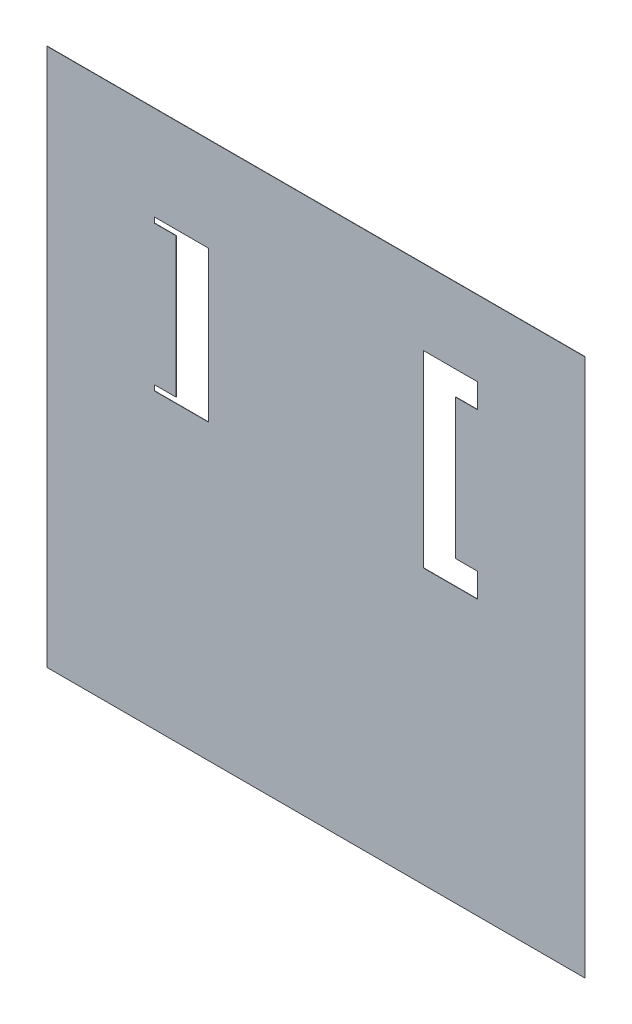
ISO-10303-21;
HEADER;
FILE_DESCRIPTION(('STEP AP214'),'2;1');
FILE_NAME('part.step','',(''),(''),'','','');
FILE_SCHEMA(('AUTOMOTIVE_DESIGN { 1 0 10303 214 1 1 1 1 }'));
ENDSEC;
DATA;
#1=APPLICATION_CONTEXT('core data for automotive mechanical design processes');
#2=APPLICATION_PROTOCOL_DEFINITION('international standard','automotive_design',2000,#1);
#3=PRODUCT_CONTEXT('',#1,'mechanical');
#4=PRODUCT('Part','Part','',(#3));
#5=PRODUCT_RELATED_PRODUCT_CATEGORY('part','',(#4));
#6=PRODUCT_DEFINITION_FORMATION('','',#4);
#7=PRODUCT_DEFINITION_CONTEXT('part definition',#1,'design');
#8=PRODUCT_DEFINITION('design','',#6,#7);
#9=PRODUCT_DEFINITION_SHAPE('','',#8);
#10=(LENGTH_UNIT() NAMED_UNIT(*) SI_UNIT(.MILLI.,.METRE.));
#11=(NAMED_UNIT(*) PLANE_ANGLE_UNIT() SI_UNIT($,.RADIAN.));
#12=(NAMED_UNIT(*) SI_UNIT($,.STERADIAN.) SOLID_ANGLE_UNIT());
#13=UNCERTAINTY_MEASURE_WITH_UNIT(LENGTH_MEASURE(1.E-05),#10,'distance_accuracy_value','');
#14=(GEOMETRIC_REPRESENTATION_CONTEXT(3) GLOBAL_UNCERTAINTY_ASSIGNED_CONTEXT((#13)) GLOBAL_UNIT_ASSIGNED_CONTEXT((#10,
#11,#12)) REPRESENTATION_CONTEXT('',''));
#15=CARTESIAN_POINT('',(0.,0.,0.));
#16=DIRECTION('',(0.,0.,1.));
#17=DIRECTION('',(1.,0.,0.));
#18=AXIS2_PLACEMENT_3D('',#15,#16,#17);
#19=CARTESIAN_POINT('',(0.,0.,0.0127));
#20=DIRECTION('',(1.,0.,0.));
#21=DIRECTION('',(0.,0.,-1.));
#22=AXIS2_PLACEMENT_3D('',#19,#20,#21);
#23=PLANE('',#22);
#24=DIRECTION('',(0.,-1.,0.));
#25=VECTOR('',#24,1.);
#26=CARTESIAN_POINT('',(0.,0.,0.));
#27=LINE('',#26,#25);
#28=CARTESIAN_POINT('',(0.,25.4,0.));
#29=VERTEX_POINT('',#28);
#30=CARTESIAN_POINT('',(0.,0.,0.));
#31=VERTEX_POINT('',#30);
#32=EDGE_CURVE('E315',#29,#31,#27,.T.);
#33=ORIENTED_EDGE('',*,*,#32,.T.);
#34=DIRECTION('',(0.,0.,-1.));
#35=VECTOR('',#34,1.);
#36=CARTESIAN_POINT('',(0.,0.,0.0127));
#37=LINE('',#36,#35);
#38=CARTESIAN_POINT('',(0.,0.,0.0127));
#39=VERTEX_POINT('',#38);
#40=EDGE_CURVE('E11',#39,#31,#37,.T.);
#41=ORIENTED_EDGE('',*,*,#40,.F.);
#42=DIRECTION('',(0.,-1.,0.));
#43=VECTOR('',#42,1.);
#44=CARTESIAN_POINT('',(0.,0.,0.0127));
#45=LINE('',#44,#43);
#46=CARTESIAN_POINT('',(0.,25.4,0.0127));
#47=VERTEX_POINT('',#46);
#48=EDGE_CURVE('E316',#47,#39,#45,.T.);
#49=ORIENTED_EDGE('',*,*,#48,.F.);
#50=DIRECTION('',(0.,0.,-1.));
#51=VECTOR('',#50,1.);
#52=CARTESIAN_POINT('',(0.,25.4,0.0127));
#53=LINE('',#52,#51);
#54=EDGE_CURVE('E326',#47,#29,#53,.T.);
#55=ORIENTED_EDGE('',*,*,#54,.T.);
#56=EDGE_LOOP('',(#33,#41,#49,#55));
#57=FACE_BOUND('',#56,.T.);
#58=ADVANCED_FACE('F34',(#57),#23,.F.);
#59=CARTESIAN_POINT('',(0.,0.,0.0127));
#60=DIRECTION('',(0.,1.,0.));
#61=DIRECTION('',(0.,0.,1.));
#62=AXIS2_PLACEMENT_3D('',#59,#60,#61);
#63=PLANE('',#62);
#64=DIRECTION('',(1.,0.,0.));
#65=VECTOR('',#64,1.);
#66=CARTESIAN_POINT('',(0.,0.,0.));
#67=LINE('',#66,#65);
#68=CARTESIAN_POINT('',(25.4,0.,0.));
#69=VERTEX_POINT('',#68);
#70=EDGE_CURVE('E329',#31,#69,#67,.T.);
#71=ORIENTED_EDGE('',*,*,#70,.T.);
#72=DIRECTION('',(0.,0.,-1.));
#73=VECTOR('',#72,1.);
#74=CARTESIAN_POINT('',(25.4,0.,0.0127));
#75=LINE('',#74,#73);
#76=CARTESIAN_POINT('',(25.4,0.,0.0127));
#77=VERTEX_POINT('',#76);
#78=EDGE_CURVE('E41',#77,#69,#75,.T.);
#79=ORIENTED_EDGE('',*,*,#78,.F.);
#80=DIRECTION('',(1.,0.,0.));
#81=VECTOR('',#80,1.);
#82=CARTESIAN_POINT('',(0.,0.,0.0127));
#83=LINE('',#82,#81);
#84=EDGE_CURVE('E319',#39,#77,#83,.T.);
#85=ORIENTED_EDGE('',*,*,#84,.F.);
#86=ORIENTED_EDGE('',*,*,#40,.T.);
#87=EDGE_LOOP('',(#71,#79,#85,#86));
#88=FACE_BOUND('',#87,.T.);
#89=ADVANCED_FACE('F358',(#88),#63,.F.);
#90=CARTESIAN_POINT('',(25.4,0.,0.0127));
#91=DIRECTION('',(-1.,0.,0.));
#92=DIRECTION('',(0.,0.,1.));
#93=AXIS2_PLACEMENT_3D('',#90,#91,#92);
#94=PLANE('',#93);
#95=DIRECTION('',(0.,1.,0.));
#96=VECTOR('',#95,1.);
#97=CARTESIAN_POINT('',(25.4,0.,0.));
#98=LINE('',#97,#96);
#99=CARTESIAN_POINT('',(25.4,25.4,0.));
#100=VERTEX_POINT('',#99);
#101=EDGE_CURVE('E331',#69,#100,#98,.T.);
#102=ORIENTED_EDGE('',*,*,#101,.T.);
#103=DIRECTION('',(0.,0.,-1.));
#104=VECTOR('',#103,1.);
#105=CARTESIAN_POINT('',(25.4,25.4,0.0127));
#106=LINE('',#105,#104);
#107=CARTESIAN_POINT('',(25.4,25.4,0.0127));
#108=VERTEX_POINT('',#107);
#109=EDGE_CURVE('E336',#108,#100,#106,.T.);
#110=ORIENTED_EDGE('',*,*,#109,.F.);
#111=DIRECTION('',(0.,1.,0.));
#112=VECTOR('',#111,1.);
#113=CARTESIAN_POINT('',(25.4,0.,0.0127));
#114=LINE('',#113,#112);
#115=EDGE_CURVE('E322',#77,#108,#114,.T.);
#116=ORIENTED_EDGE('',*,*,#115,.F.);
#117=ORIENTED_EDGE('',*,*,#78,.T.);
#118=EDGE_LOOP('',(#102,#110,#116,#117));
#119=FACE_BOUND('',#118,.T.);
#120=ADVANCED_FACE('F343',(#119),#94,.F.);
#121=CARTESIAN_POINT('',(0.,25.4,0.0127));
#122=DIRECTION('',(0.,-1.,0.));
#123=DIRECTION('',(0.,0.,-1.));
#124=AXIS2_PLACEMENT_3D('',#121,#122,#123);
#125=PLANE('',#124);
#126=DIRECTION('',(-1.,0.,0.));
#127=VECTOR('',#126,1.);
#128=CARTESIAN_POINT('',(0.,25.4,0.));
#129=LINE('',#128,#127);
#130=EDGE_CURVE('E320',#100,#29,#129,.T.);
#131=ORIENTED_EDGE('',*,*,#130,.T.);
#132=ORIENTED_EDGE('',*,*,#54,.F.);
#133=DIRECTION('',(-1.,0.,0.));
#134=VECTOR('',#133,1.);
#135=CARTESIAN_POINT('',(0.,25.4,0.0127));
#136=LINE('',#135,#134);
#137=EDGE_CURVE('E324',#108,#47,#136,.T.);
#138=ORIENTED_EDGE('',*,*,#137,.F.);
#139=ORIENTED_EDGE('',*,*,#109,.T.);
#140=EDGE_LOOP('',(#131,#132,#138,#139));
#141=FACE_BOUND('',#140,.T.);
#142=ADVANCED_FACE('F351',(#141),#125,.F.);
#143=CARTESIAN_POINT('',(0.,0.,0.0127));
#144=DIRECTION('',(0.,0.,-1.));
#145=DIRECTION('',(-1.,0.,0.));
#146=AXIS2_PLACEMENT_3D('',#143,#144,#145);
#147=PLANE('',#146);
#148=DIRECTION('',(-1.,0.,0.));
#149=VECTOR('',#148,1.);
#150=CARTESIAN_POINT('',(0.,12.954,0.0127));
#151=LINE('',#150,#149);
#152=CARTESIAN_POINT('',(20.32,12.954,0.0127));
#153=VERTEX_POINT('',#152);
#154=CARTESIAN_POINT('',(17.78,12.954,0.0127));
#155=VERTEX_POINT('',#154);
#156=EDGE_CURVE('E207',#153,#155,#151,.T.);
#157=ORIENTED_EDGE('',*,*,#156,.T.);
#158=DIRECTION('',(0.,1.,0.));
#159=VECTOR('',#158,1.);
#160=CARTESIAN_POINT('',(17.78,0.,0.0127));
#161=LINE('',#160,#159);
#162=CARTESIAN_POINT('',(17.78,21.844,0.0127));
#163=VERTEX_POINT('',#162);
#164=EDGE_CURVE('E176',#155,#163,#161,.T.);
#165=ORIENTED_EDGE('',*,*,#164,.T.);
#166=DIRECTION('',(1.,0.,0.));
#167=VECTOR('',#166,1.);
#168=CARTESIAN_POINT('',(0.,21.844,0.0127));
#169=LINE('',#168,#167);
#170=CARTESIAN_POINT('',(20.32,21.844,0.0127));
#171=VERTEX_POINT('',#170);
#172=EDGE_CURVE('E240',#163,#171,#169,.T.);
#173=ORIENTED_EDGE('',*,*,#172,.T.);
#174=DIRECTION('',(0.,-1.,0.));
#175=VECTOR('',#174,1.);
#176=CARTESIAN_POINT('',(20.3200000000001,1.2335811384724E-13,0.0127));
#177=LINE('',#176,#175);
#178=CARTESIAN_POINT('',(20.32,20.701,0.0127));
#179=VERTEX_POINT('',#178);
#180=EDGE_CURVE('E237',#171,#179,#177,.T.);
#181=ORIENTED_EDGE('',*,*,#180,.T.);
#182=DIRECTION('',(-1.,0.,0.));
#183=VECTOR('',#182,1.);
#184=CARTESIAN_POINT('',(0.,20.701,0.0127));
#185=LINE('',#184,#183);
#186=CARTESIAN_POINT('',(19.304,20.701,0.0127));
#187=VERTEX_POINT('',#186);
#188=EDGE_CURVE('E234',#179,#187,#185,.T.);
#189=ORIENTED_EDGE('',*,*,#188,.T.);
#190=DIRECTION('',(0.,-1.,0.));
#191=VECTOR('',#190,1.);
#192=CARTESIAN_POINT('',(19.304,0.,0.0127));
#193=LINE('',#192,#191);
#194=CARTESIAN_POINT('',(19.304,14.097,0.0127));
#195=VERTEX_POINT('',#194);
#196=EDGE_CURVE('E231',#187,#195,#193,.T.);
#197=ORIENTED_EDGE('',*,*,#196,.T.);
#198=DIRECTION('',(1.,0.,0.));
#199=VECTOR('',#198,1.);
#200=CARTESIAN_POINT('',(0.,14.097,0.0127));
#201=LINE('',#200,#199);
#202=CARTESIAN_POINT('',(20.32,14.097,0.0127));
#203=VERTEX_POINT('',#202);
#204=EDGE_CURVE('E228',#195,#203,#201,.T.);
#205=ORIENTED_EDGE('',*,*,#204,.T.);
#206=DIRECTION('',(0.,-1.,0.));
#207=VECTOR('',#206,1.);
#208=CARTESIAN_POINT('',(20.3199999999999,-1.85037170770858E-13,0.0127));
#209=LINE('',#208,#207);
#210=EDGE_CURVE('E225',#203,#153,#209,.T.);
#211=ORIENTED_EDGE('',*,*,#210,.T.);
#212=EDGE_LOOP('',(#157,#165,#173,#181,#189,#197,#205,#211));
#213=FACE_BOUND('',#212,.T.);
#214=DIRECTION('',(-1.,0.,0.));
#215=VECTOR('',#214,1.);
#216=CARTESIAN_POINT('',(0.,20.701,0.0127));
#217=LINE('',#216,#215);
#218=CARTESIAN_POINT('',(6.096,20.701,0.0127));
#219=VERTEX_POINT('',#218);
#220=CARTESIAN_POINT('',(5.08,20.701,0.0127));
#221=VERTEX_POINT('',#220);
#222=EDGE_CURVE('E272',#219,#221,#217,.T.);
#223=ORIENTED_EDGE('',*,*,#222,.T.);
#224=DIRECTION('',(0.,1.,0.));
#225=VECTOR('',#224,1.);
#226=CARTESIAN_POINT('',(5.08000000000014,0.,0.0127));
#227=LINE('',#226,#225);
#228=CARTESIAN_POINT('',(5.08,20.955,0.0127));
#229=VERTEX_POINT('',#228);
#230=EDGE_CURVE('E312',#221,#229,#227,.T.);
#231=ORIENTED_EDGE('',*,*,#230,.T.);
#232=DIRECTION('',(1.,0.,0.));
#233=VECTOR('',#232,1.);
#234=CARTESIAN_POINT('',(0.,20.955,0.0127));
#235=LINE('',#234,#233);
#236=CARTESIAN_POINT('',(7.62,20.955,0.0127));
#237=VERTEX_POINT('',#236);
#238=EDGE_CURVE('E309',#229,#237,#235,.T.);
#239=ORIENTED_EDGE('',*,*,#238,.T.);
#240=DIRECTION('',(0.,-1.,0.));
#241=VECTOR('',#240,1.);
#242=CARTESIAN_POINT('',(7.62,0.,0.0127));
#243=LINE('',#242,#241);
#244=CARTESIAN_POINT('',(7.62,13.843,0.0127));
#245=VERTEX_POINT('',#244);
#246=EDGE_CURVE('E306',#237,#245,#243,.T.);
#247=ORIENTED_EDGE('',*,*,#246,.T.);
#248=DIRECTION('',(-1.,0.,0.));
#249=VECTOR('',#248,1.);
#250=CARTESIAN_POINT('',(0.,13.843,0.0127));
#251=LINE('',#250,#249);
#252=CARTESIAN_POINT('',(5.08,13.843,0.0127));
#253=VERTEX_POINT('',#252);
#254=EDGE_CURVE('E303',#245,#253,#251,.T.);
#255=ORIENTED_EDGE('',*,*,#254,.T.);
#256=DIRECTION('',(0.,1.,0.));
#257=VECTOR('',#256,1.);
#258=CARTESIAN_POINT('',(5.08,0.,0.0127));
#259=LINE('',#258,#257);
#260=CARTESIAN_POINT('',(5.08,14.097,0.0127));
#261=VERTEX_POINT('',#260);
#262=EDGE_CURVE('E300',#253,#261,#259,.T.);
#263=ORIENTED_EDGE('',*,*,#262,.T.);
#264=DIRECTION('',(1.,0.,0.));
#265=VECTOR('',#264,1.);
#266=CARTESIAN_POINT('',(0.,14.097,0.0127));
#267=LINE('',#266,#265);
#268=CARTESIAN_POINT('',(6.096,14.097,0.0127));
#269=VERTEX_POINT('',#268);
#270=EDGE_CURVE('E297',#261,#269,#267,.T.);
#271=ORIENTED_EDGE('',*,*,#270,.T.);
#272=DIRECTION('',(0.,1.,0.));
#273=VECTOR('',#272,1.);
#274=CARTESIAN_POINT('',(6.096,0.,0.0127));
#275=LINE('',#274,#273);
#276=EDGE_CURVE('E294',#269,#219,#275,.T.);
#277=ORIENTED_EDGE('',*,*,#276,.T.);
#278=EDGE_LOOP('',(#223,#231,#239,#247,#255,#263,#271,#277));
#279=FACE_BOUND('',#278,.T.);
#280=ORIENTED_EDGE('',*,*,#48,.T.);
#281=ORIENTED_EDGE('',*,*,#84,.T.);
#282=ORIENTED_EDGE('',*,*,#115,.T.);
#283=ORIENTED_EDGE('',*,*,#137,.T.);
#284=EDGE_LOOP('',(#280,#281,#282,#283));
#285=FACE_BOUND('',#284,.T.);
#286=ADVANCED_FACE('F357',(#213,#279,#285),#147,.F.);
#287=CARTESIAN_POINT('',(0.,0.,0.));
#288=DIRECTION('',(0.,0.,-1.));
#289=DIRECTION('',(-1.,0.,0.));
#290=AXIS2_PLACEMENT_3D('',#287,#288,#289);
#291=PLANE('',#290);
#292=DIRECTION('',(0.,-1.,0.));
#293=VECTOR('',#292,1.);
#294=CARTESIAN_POINT('',(17.78,21.844,0.));
#295=LINE('',#294,#293);
#296=CARTESIAN_POINT('',(17.78,21.844,0.));
#297=VERTEX_POINT('',#296);
#298=CARTESIAN_POINT('',(17.78,12.954,0.));
#299=VERTEX_POINT('',#298);
#300=EDGE_CURVE('E173',#297,#299,#295,.T.);
#301=ORIENTED_EDGE('',*,*,#300,.T.);
#302=DIRECTION('',(1.,0.,0.));
#303=VECTOR('',#302,1.);
#304=CARTESIAN_POINT('',(17.78,12.954,0.));
#305=LINE('',#304,#303);
#306=CARTESIAN_POINT('',(20.32,12.954,0.));
#307=VERTEX_POINT('',#306);
#308=EDGE_CURVE('E182',#299,#307,#305,.T.);
#309=ORIENTED_EDGE('',*,*,#308,.T.);
#310=DIRECTION('',(0.,1.,0.));
#311=VECTOR('',#310,1.);
#312=CARTESIAN_POINT('',(20.32,14.097,0.));
#313=LINE('',#312,#311);
#314=CARTESIAN_POINT('',(20.32,14.097,0.));
#315=VERTEX_POINT('',#314);
#316=EDGE_CURVE('E56',#307,#315,#313,.T.);
#317=ORIENTED_EDGE('',*,*,#316,.T.);
#318=DIRECTION('',(-1.,0.,0.));
#319=VECTOR('',#318,1.);
#320=CARTESIAN_POINT('',(20.32,14.097,0.));
#321=LINE('',#320,#319);
#322=CARTESIAN_POINT('',(19.304,14.097,0.));
#323=VERTEX_POINT('',#322);
#324=EDGE_CURVE('E193',#315,#323,#321,.T.);
#325=ORIENTED_EDGE('',*,*,#324,.T.);
#326=DIRECTION('',(0.,1.,0.));
#327=VECTOR('',#326,1.);
#328=CARTESIAN_POINT('',(19.304,14.097,0.));
#329=LINE('',#328,#327);
#330=CARTESIAN_POINT('',(19.304,20.701,0.));
#331=VERTEX_POINT('',#330);
#332=EDGE_CURVE('E196',#323,#331,#329,.T.);
#333=ORIENTED_EDGE('',*,*,#332,.T.);
#334=DIRECTION('',(1.,0.,0.));
#335=VECTOR('',#334,1.);
#336=CARTESIAN_POINT('',(20.32,20.701,0.));
#337=LINE('',#336,#335);
#338=CARTESIAN_POINT('',(20.32,20.701,0.));
#339=VERTEX_POINT('',#338);
#340=EDGE_CURVE('E199',#331,#339,#337,.T.);
#341=ORIENTED_EDGE('',*,*,#340,.T.);
#342=DIRECTION('',(0.,1.,0.));
#343=VECTOR('',#342,1.);
#344=CARTESIAN_POINT('',(20.32,21.844,0.));
#345=LINE('',#344,#343);
#346=CARTESIAN_POINT('',(20.32,21.844,0.));
#347=VERTEX_POINT('',#346);
#348=EDGE_CURVE('E202',#339,#347,#345,.T.);
#349=ORIENTED_EDGE('',*,*,#348,.T.);
#350=DIRECTION('',(-1.,0.,0.));
#351=VECTOR('',#350,1.);
#352=CARTESIAN_POINT('',(17.78,21.844,0.));
#353=LINE('',#352,#351);
#354=EDGE_CURVE('E179',#347,#297,#353,.T.);
#355=ORIENTED_EDGE('',*,*,#354,.T.);
#356=EDGE_LOOP('',(#301,#309,#317,#325,#333,#341,#349,#355));
#357=FACE_BOUND('',#356,.T.);
#358=DIRECTION('',(0.,-1.,0.));
#359=VECTOR('',#358,1.);
#360=CARTESIAN_POINT('',(5.08,20.955,0.));
#361=LINE('',#360,#359);
#362=CARTESIAN_POINT('',(5.08,20.955,0.));
#363=VERTEX_POINT('',#362);
#364=CARTESIAN_POINT('',(5.08,20.701,0.));
#365=VERTEX_POINT('',#364);
#366=EDGE_CURVE('E244',#363,#365,#361,.T.);
#367=ORIENTED_EDGE('',*,*,#366,.T.);
#368=DIRECTION('',(1.,0.,0.));
#369=VECTOR('',#368,1.);
#370=CARTESIAN_POINT('',(5.08,20.701,0.));
#371=LINE('',#370,#369);
#372=CARTESIAN_POINT('',(6.096,20.701,0.));
#373=VERTEX_POINT('',#372);
#374=EDGE_CURVE('E247',#365,#373,#371,.T.);
#375=ORIENTED_EDGE('',*,*,#374,.T.);
#376=DIRECTION('',(0.,-1.,0.));
#377=VECTOR('',#376,1.);
#378=CARTESIAN_POINT('',(6.096,14.097,0.));
#379=LINE('',#378,#377);
#380=CARTESIAN_POINT('',(6.096,14.097,0.));
#381=VERTEX_POINT('',#380);
#382=EDGE_CURVE('E250',#373,#381,#379,.T.);
#383=ORIENTED_EDGE('',*,*,#382,.T.);
#384=DIRECTION('',(-1.,0.,0.));
#385=VECTOR('',#384,1.);
#386=CARTESIAN_POINT('',(5.08,14.097,0.));
#387=LINE('',#386,#385);
#388=CARTESIAN_POINT('',(5.08,14.097,0.));
#389=VERTEX_POINT('',#388);
#390=EDGE_CURVE('E253',#381,#389,#387,.T.);
#391=ORIENTED_EDGE('',*,*,#390,.T.);
#392=DIRECTION('',(0.,-1.,0.));
#393=VECTOR('',#392,1.);
#394=CARTESIAN_POINT('',(5.08,14.097,0.));
#395=LINE('',#394,#393);
#396=CARTESIAN_POINT('',(5.08,13.843,0.));
#397=VERTEX_POINT('',#396);
#398=EDGE_CURVE('E256',#389,#397,#395,.T.);
#399=ORIENTED_EDGE('',*,*,#398,.T.);
#400=DIRECTION('',(1.,0.,0.));
#401=VECTOR('',#400,1.);
#402=CARTESIAN_POINT('',(5.08,13.843,0.));
#403=LINE('',#402,#401);
#404=CARTESIAN_POINT('',(7.62,13.843,0.));
#405=VERTEX_POINT('',#404);
#406=EDGE_CURVE('E259',#397,#405,#403,.T.);
#407=ORIENTED_EDGE('',*,*,#406,.T.);
#408=DIRECTION('',(0.,1.,0.));
#409=VECTOR('',#408,1.);
#410=CARTESIAN_POINT('',(7.62,20.955,0.));
#411=LINE('',#410,#409);
#412=CARTESIAN_POINT('',(7.62,20.955,0.));
#413=VERTEX_POINT('',#412);
#414=EDGE_CURVE('E262',#405,#413,#411,.T.);
#415=ORIENTED_EDGE('',*,*,#414,.T.);
#416=DIRECTION('',(-1.,0.,0.));
#417=VECTOR('',#416,1.);
#418=CARTESIAN_POINT('',(5.08,20.955,0.));
#419=LINE('',#418,#417);
#420=EDGE_CURVE('E265',#413,#363,#419,.T.);
#421=ORIENTED_EDGE('',*,*,#420,.T.);
#422=EDGE_LOOP('',(#367,#375,#383,#391,#399,#407,#415,#421));
#423=FACE_BOUND('',#422,.T.);
#424=ORIENTED_EDGE('',*,*,#32,.F.);
#425=ORIENTED_EDGE('',*,*,#130,.F.);
#426=ORIENTED_EDGE('',*,*,#101,.F.);
#427=ORIENTED_EDGE('',*,*,#70,.F.);
#428=EDGE_LOOP('',(#424,#425,#426,#427));
#429=FACE_BOUND('',#428,.T.);
#430=ADVANCED_FACE('F186',(#357,#423,#429),#291,.T.);
#431=CARTESIAN_POINT('',(5.08,20.955,0.));
#432=DIRECTION('',(-1.,0.,0.));
#433=DIRECTION('',(0.,-1.,0.));
#434=AXIS2_PLACEMENT_3D('',#431,#432,#433);
#435=PLANE('',#434);
#436=DIRECTION('',(0.,0.,1.));
#437=VECTOR('',#436,1.);
#438=CARTESIAN_POINT('',(5.08,20.701,0.));
#439=LINE('',#438,#437);
#440=EDGE_CURVE('E268',#365,#221,#439,.T.);
#441=ORIENTED_EDGE('',*,*,#440,.F.);
#442=ORIENTED_EDGE('',*,*,#366,.F.);
#443=DIRECTION('',(0.,0.,1.));
#444=VECTOR('',#443,1.);
#445=CARTESIAN_POINT('',(5.08,20.955,0.));
#446=LINE('',#445,#444);
#447=EDGE_CURVE('E269',#363,#229,#446,.T.);
#448=ORIENTED_EDGE('',*,*,#447,.T.);
#449=ORIENTED_EDGE('',*,*,#230,.F.);
#450=EDGE_LOOP('',(#441,#442,#448,#449));
#451=FACE_BOUND('',#450,.T.);
#452=ADVANCED_FACE('F370',(#451),#435,.F.);
#453=CARTESIAN_POINT('',(5.08,20.955,0.));
#454=DIRECTION('',(0.,1.,0.));
#455=DIRECTION('',(0.,0.,1.));
#456=AXIS2_PLACEMENT_3D('',#453,#454,#455);
#457=PLANE('',#456);
#458=ORIENTED_EDGE('',*,*,#447,.F.);
#459=ORIENTED_EDGE('',*,*,#420,.F.);
#460=DIRECTION('',(0.,0.,1.));
#461=VECTOR('',#460,1.);
#462=CARTESIAN_POINT('',(7.62,20.955,0.));
#463=LINE('',#462,#461);
#464=EDGE_CURVE('E273',#413,#237,#463,.T.);
#465=ORIENTED_EDGE('',*,*,#464,.T.);
#466=ORIENTED_EDGE('',*,*,#238,.F.);
#467=EDGE_LOOP('',(#458,#459,#465,#466));
#468=FACE_BOUND('',#467,.T.);
#469=ADVANCED_FACE('F376',(#468),#457,.F.);
#470=CARTESIAN_POINT('',(7.62,20.955,0.));
#471=DIRECTION('',(1.,0.,0.));
#472=DIRECTION('',(0.,0.,-1.));
#473=AXIS2_PLACEMENT_3D('',#470,#471,#472);
#474=PLANE('',#473);
#475=ORIENTED_EDGE('',*,*,#464,.F.);
#476=ORIENTED_EDGE('',*,*,#414,.F.);
#477=DIRECTION('',(0.,0.,1.));
#478=VECTOR('',#477,1.);
#479=CARTESIAN_POINT('',(7.62,13.843,0.));
#480=LINE('',#479,#478);
#481=EDGE_CURVE('E276',#405,#245,#480,.T.);
#482=ORIENTED_EDGE('',*,*,#481,.T.);
#483=ORIENTED_EDGE('',*,*,#246,.F.);
#484=EDGE_LOOP('',(#475,#476,#482,#483));
#485=FACE_BOUND('',#484,.T.);
#486=ADVANCED_FACE('F397',(#485),#474,.F.);
#487=CARTESIAN_POINT('',(5.08,13.843,0.));
#488=DIRECTION('',(0.,-1.,0.));
#489=DIRECTION('',(0.,0.,-1.));
#490=AXIS2_PLACEMENT_3D('',#487,#488,#489);
#491=PLANE('',#490);
#492=ORIENTED_EDGE('',*,*,#481,.F.);
#493=ORIENTED_EDGE('',*,*,#406,.F.);
#494=DIRECTION('',(0.,0.,1.));
#495=VECTOR('',#494,1.);
#496=CARTESIAN_POINT('',(5.08,13.843,0.));
#497=LINE('',#496,#495);
#498=EDGE_CURVE('E279',#397,#253,#497,.T.);
#499=ORIENTED_EDGE('',*,*,#498,.T.);
#500=ORIENTED_EDGE('',*,*,#254,.F.);
#501=EDGE_LOOP('',(#492,#493,#499,#500));
#502=FACE_BOUND('',#501,.T.);
#503=ADVANCED_FACE('F393',(#502),#491,.F.);
#504=CARTESIAN_POINT('',(5.08,14.097,0.));
#505=DIRECTION('',(-1.,0.,0.));
#506=DIRECTION('',(0.,0.,1.));
#507=AXIS2_PLACEMENT_3D('',#504,#505,#506);
#508=PLANE('',#507);
#509=ORIENTED_EDGE('',*,*,#498,.F.);
#510=ORIENTED_EDGE('',*,*,#398,.F.);
#511=DIRECTION('',(0.,0.,1.));
#512=VECTOR('',#511,1.);
#513=CARTESIAN_POINT('',(5.08,14.097,0.));
#514=LINE('',#513,#512);
#515=EDGE_CURVE('E282',#389,#261,#514,.T.);
#516=ORIENTED_EDGE('',*,*,#515,.T.);
#517=ORIENTED_EDGE('',*,*,#262,.F.);
#518=EDGE_LOOP('',(#509,#510,#516,#517));
#519=FACE_BOUND('',#518,.T.);
#520=ADVANCED_FACE('F389',(#519),#508,.F.);
#521=CARTESIAN_POINT('',(5.08,14.097,0.));
#522=DIRECTION('',(0.,1.,0.));
#523=DIRECTION('',(0.,0.,1.));
#524=AXIS2_PLACEMENT_3D('',#521,#522,#523);
#525=PLANE('',#524);
#526=ORIENTED_EDGE('',*,*,#515,.F.);
#527=ORIENTED_EDGE('',*,*,#390,.F.);
#528=DIRECTION('',(0.,0.,1.));
#529=VECTOR('',#528,1.);
#530=CARTESIAN_POINT('',(6.096,14.097,0.));
#531=LINE('',#530,#529);
#532=EDGE_CURVE('E285',#381,#269,#531,.T.);
#533=ORIENTED_EDGE('',*,*,#532,.T.);
#534=ORIENTED_EDGE('',*,*,#270,.F.);
#535=EDGE_LOOP('',(#526,#527,#533,#534));
#536=FACE_BOUND('',#535,.T.);
#537=ADVANCED_FACE('F385',(#536),#525,.F.);
#538=CARTESIAN_POINT('',(6.096,14.097,0.));
#539=DIRECTION('',(-1.,0.,0.));
#540=DIRECTION('',(0.,0.,1.));
#541=AXIS2_PLACEMENT_3D('',#538,#539,#540);
#542=PLANE('',#541);
#543=ORIENTED_EDGE('',*,*,#532,.F.);
#544=ORIENTED_EDGE('',*,*,#382,.F.);
#545=DIRECTION('',(0.,0.,1.));
#546=VECTOR('',#545,1.);
#547=CARTESIAN_POINT('',(6.096,20.701,0.));
#548=LINE('',#547,#546);
#549=EDGE_CURVE('E288',#373,#219,#548,.T.);
#550=ORIENTED_EDGE('',*,*,#549,.T.);
#551=ORIENTED_EDGE('',*,*,#276,.F.);
#552=EDGE_LOOP('',(#543,#544,#550,#551));
#553=FACE_BOUND('',#552,.T.);
#554=ADVANCED_FACE('F381',(#553),#542,.F.);
#555=CARTESIAN_POINT('',(5.08,20.701,0.));
#556=DIRECTION('',(0.,-1.,0.));
#557=DIRECTION('',(0.,0.,-1.));
#558=AXIS2_PLACEMENT_3D('',#555,#556,#557);
#559=PLANE('',#558);
#560=ORIENTED_EDGE('',*,*,#549,.F.);
#561=ORIENTED_EDGE('',*,*,#374,.F.);
#562=ORIENTED_EDGE('',*,*,#440,.T.);
#563=ORIENTED_EDGE('',*,*,#222,.F.);
#564=EDGE_LOOP('',(#560,#561,#562,#563));
#565=FACE_BOUND('',#564,.T.);
#566=ADVANCED_FACE('F378',(#565),#559,.F.);
#567=CARTESIAN_POINT('',(17.78,21.844,0.));
#568=DIRECTION('',(-1.,0.,0.));
#569=DIRECTION('',(0.,0.,1.));
#570=AXIS2_PLACEMENT_3D('',#567,#568,#569);
#571=PLANE('',#570);
#572=DIRECTION('',(0.,0.,1.));
#573=VECTOR('',#572,1.);
#574=CARTESIAN_POINT('',(17.78,12.954,0.));
#575=LINE('',#574,#573);
#576=EDGE_CURVE('E48',#299,#155,#575,.T.);
#577=ORIENTED_EDGE('',*,*,#576,.F.);
#578=ORIENTED_EDGE('',*,*,#300,.F.);
#579=DIRECTION('',(0.,0.,1.));
#580=VECTOR('',#579,1.);
#581=CARTESIAN_POINT('',(17.78,21.844,0.));
#582=LINE('',#581,#580);
#583=EDGE_CURVE('E205',#297,#163,#582,.T.);
#584=ORIENTED_EDGE('',*,*,#583,.T.);
#585=ORIENTED_EDGE('',*,*,#164,.F.);
#586=EDGE_LOOP('',(#577,#578,#584,#585));
#587=FACE_BOUND('',#586,.T.);
#588=ADVANCED_FACE('F170',(#587),#571,.F.);
#589=CARTESIAN_POINT('',(17.78,21.844,0.));
#590=DIRECTION('',(0.,1.,0.));
#591=DIRECTION('',(0.,0.,1.));
#592=AXIS2_PLACEMENT_3D('',#589,#590,#591);
#593=PLANE('',#592);
#594=ORIENTED_EDGE('',*,*,#583,.F.);
#595=ORIENTED_EDGE('',*,*,#354,.F.);
#596=DIRECTION('',(0.,0.,1.));
#597=VECTOR('',#596,1.);
#598=CARTESIAN_POINT('',(20.32,21.844,0.));
#599=LINE('',#598,#597);
#600=EDGE_CURVE('E208',#347,#171,#599,.T.);
#601=ORIENTED_EDGE('',*,*,#600,.T.);
#602=ORIENTED_EDGE('',*,*,#172,.F.);
#603=EDGE_LOOP('',(#594,#595,#601,#602));
#604=FACE_BOUND('',#603,.T.);
#605=ADVANCED_FACE('F407',(#604),#593,.F.);
#606=CARTESIAN_POINT('',(20.32,21.844,0.));
#607=DIRECTION('',(1.,0.,0.));
#608=DIRECTION('',(0.,1.,0.));
#609=AXIS2_PLACEMENT_3D('',#606,#607,#608);
#610=PLANE('',#609);
#611=ORIENTED_EDGE('',*,*,#600,.F.);
#612=ORIENTED_EDGE('',*,*,#348,.F.);
#613=DIRECTION('',(0.,0.,1.));
#614=VECTOR('',#613,1.);
#615=CARTESIAN_POINT('',(20.32,20.701,0.));
#616=LINE('',#615,#614);
#617=EDGE_CURVE('E211',#339,#179,#616,.T.);
#618=ORIENTED_EDGE('',*,*,#617,.T.);
#619=ORIENTED_EDGE('',*,*,#180,.F.);
#620=EDGE_LOOP('',(#611,#612,#618,#619));
#621=FACE_BOUND('',#620,.T.);
#622=ADVANCED_FACE('F424',(#621),#610,.F.);
#623=CARTESIAN_POINT('',(20.32,20.701,0.));
#624=DIRECTION('',(0.,-1.,0.));
#625=DIRECTION('',(0.,0.,-1.));
#626=AXIS2_PLACEMENT_3D('',#623,#624,#625);
#627=PLANE('',#626);
#628=ORIENTED_EDGE('',*,*,#617,.F.);
#629=ORIENTED_EDGE('',*,*,#340,.F.);
#630=DIRECTION('',(0.,0.,1.));
#631=VECTOR('',#630,1.);
#632=CARTESIAN_POINT('',(19.304,20.701,0.));
#633=LINE('',#632,#631);
#634=EDGE_CURVE('E214',#331,#187,#633,.T.);
#635=ORIENTED_EDGE('',*,*,#634,.T.);
#636=ORIENTED_EDGE('',*,*,#188,.F.);
#637=EDGE_LOOP('',(#628,#629,#635,#636));
#638=FACE_BOUND('',#637,.T.);
#639=ADVANCED_FACE('F420',(#638),#627,.F.);
#640=CARTESIAN_POINT('',(19.304,14.097,0.));
#641=DIRECTION('',(1.,0.,0.));
#642=DIRECTION('',(0.,0.,-1.));
#643=AXIS2_PLACEMENT_3D('',#640,#641,#642);
#644=PLANE('',#643);
#645=ORIENTED_EDGE('',*,*,#634,.F.);
#646=ORIENTED_EDGE('',*,*,#332,.F.);
#647=DIRECTION('',(0.,0.,1.));
#648=VECTOR('',#647,1.);
#649=CARTESIAN_POINT('',(19.304,14.097,0.));
#650=LINE('',#649,#648);
#651=EDGE_CURVE('E217',#323,#195,#650,.T.);
#652=ORIENTED_EDGE('',*,*,#651,.T.);
#653=ORIENTED_EDGE('',*,*,#196,.F.);
#654=EDGE_LOOP('',(#645,#646,#652,#653));
#655=FACE_BOUND('',#654,.T.);
#656=ADVANCED_FACE('F416',(#655),#644,.F.);
#657=CARTESIAN_POINT('',(20.32,14.097,0.));
#658=DIRECTION('',(0.,1.,0.));
#659=DIRECTION('',(-1.,0.,0.));
#660=AXIS2_PLACEMENT_3D('',#657,#658,#659);
#661=PLANE('',#660);
#662=ORIENTED_EDGE('',*,*,#651,.F.);
#663=ORIENTED_EDGE('',*,*,#324,.F.);
#664=DIRECTION('',(0.,0.,1.));
#665=VECTOR('',#664,1.);
#666=CARTESIAN_POINT('',(20.32,14.097,0.));
#667=LINE('',#666,#665);
#668=EDGE_CURVE('E220',#315,#203,#667,.T.);
#669=ORIENTED_EDGE('',*,*,#668,.T.);
#670=ORIENTED_EDGE('',*,*,#204,.F.);
#671=EDGE_LOOP('',(#662,#663,#669,#670));
#672=FACE_BOUND('',#671,.T.);
#673=ADVANCED_FACE('F413',(#672),#661,.F.);
#674=CARTESIAN_POINT('',(20.32,14.097,0.));
#675=DIRECTION('',(1.,0.,0.));
#676=DIRECTION('',(0.,1.,0.));
#677=AXIS2_PLACEMENT_3D('',#674,#675,#676);
#678=PLANE('',#677);
#679=ORIENTED_EDGE('',*,*,#668,.F.);
#680=ORIENTED_EDGE('',*,*,#316,.F.);
#681=DIRECTION('',(0.,0.,1.));
#682=VECTOR('',#681,1.);
#683=CARTESIAN_POINT('',(20.32,12.954,0.));
#684=LINE('',#683,#682);
#685=EDGE_CURVE('E178',#307,#153,#684,.T.);
#686=ORIENTED_EDGE('',*,*,#685,.T.);
#687=ORIENTED_EDGE('',*,*,#210,.F.);
#688=EDGE_LOOP('',(#679,#680,#686,#687));
#689=FACE_BOUND('',#688,.T.);
#690=ADVANCED_FACE('F410',(#689),#678,.F.);
#691=CARTESIAN_POINT('',(17.78,12.954,0.));
#692=DIRECTION('',(0.,-1.,0.));
#693=DIRECTION('',(0.,0.,-1.));
#694=AXIS2_PLACEMENT_3D('',#691,#692,#693);
#695=PLANE('',#694);
#696=ORIENTED_EDGE('',*,*,#685,.F.);
#697=ORIENTED_EDGE('',*,*,#308,.F.);
#698=ORIENTED_EDGE('',*,*,#576,.T.);
#699=ORIENTED_EDGE('',*,*,#156,.F.);
#700=EDGE_LOOP('',(#696,#697,#698,#699));
#701=FACE_BOUND('',#700,.T.);
#702=ADVANCED_FACE('F183',(#701),#695,.F.);
#703=CLOSED_SHELL('',(#58,#89,#120,#142,#286,#430,#452,#469,#486,#503,#520,#537,#554,#566,#588,
#605,#622,#639,#656,#673,#690,#702));
#704=MANIFOLD_SOLID_BREP('B2',#703);
#705=ADVANCED_BREP_SHAPE_REPRESENTATION('',(#18,#704),#14);
#706=SHAPE_DEFINITION_REPRESENTATION(#9,#705);
ENDSEC;
END-ISO-10303-21;
